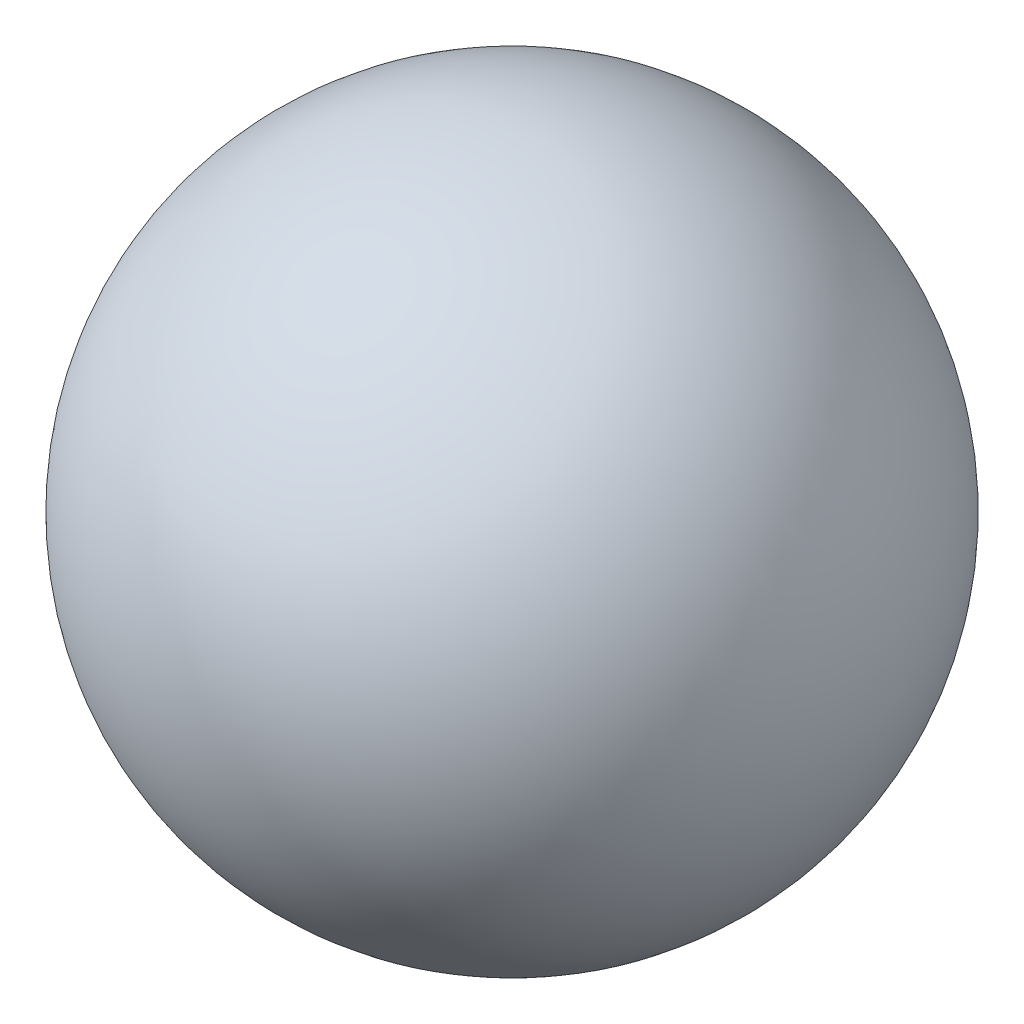
ISO-10303-21;
HEADER;
FILE_DESCRIPTION(('STEP AP214'),'2;1');
FILE_NAME('part.step','',(''),(''),'','','');
FILE_SCHEMA(('AUTOMOTIVE_DESIGN { 1 0 10303 214 1 1 1 1 }'));
ENDSEC;
DATA;
#1=APPLICATION_CONTEXT('core data for automotive mechanical design processes');
#2=APPLICATION_PROTOCOL_DEFINITION('international standard','automotive_design',2000,#1);
#3=PRODUCT_CONTEXT('',#1,'mechanical');
#4=PRODUCT('Part','Part','',(#3));
#5=PRODUCT_RELATED_PRODUCT_CATEGORY('part','',(#4));
#6=PRODUCT_DEFINITION_FORMATION('','',#4);
#7=PRODUCT_DEFINITION_CONTEXT('part definition',#1,'design');
#8=PRODUCT_DEFINITION('design','',#6,#7);
#9=PRODUCT_DEFINITION_SHAPE('','',#8);
#10=(LENGTH_UNIT() NAMED_UNIT(*) SI_UNIT(.MILLI.,.METRE.));
#11=(NAMED_UNIT(*) PLANE_ANGLE_UNIT() SI_UNIT($,.RADIAN.));
#12=(NAMED_UNIT(*) SI_UNIT($,.STERADIAN.) SOLID_ANGLE_UNIT());
#13=UNCERTAINTY_MEASURE_WITH_UNIT(LENGTH_MEASURE(1.E-05),#10,'distance_accuracy_value','');
#14=(GEOMETRIC_REPRESENTATION_CONTEXT(3) GLOBAL_UNCERTAINTY_ASSIGNED_CONTEXT((#13)) GLOBAL_UNIT_ASSIGNED_CONTEXT((#10,
#11,#12)) REPRESENTATION_CONTEXT('',''));
#15=CARTESIAN_POINT('',(0.,0.,0.));
#16=DIRECTION('',(0.,0.,1.));
#17=DIRECTION('',(1.,0.,0.));
#18=AXIS2_PLACEMENT_3D('',#15,#16,#17);
#19=CARTESIAN_POINT('',(121.253630277684,114.595584396519,22.5449391064666));
#20=DIRECTION('',(0.,1.,0.));
#21=DIRECTION('',(1.,0.,0.));
#22=AXIS2_PLACEMENT_3D('',#19,#20,#21);
#23=SPHERICAL_SURFACE('',#22,20.1231248708449);
#24=CARTESIAN_POINT('',(121.253630277684,134.718709267364,22.5449391064666));
#25=VERTEX_POINT('',#24);
#26=VERTEX_LOOP('',#25);
#27=FACE_BOUND('',#26,.T.);
#28=ADVANCED_FACE('F35',(#27),#23,.T.);
#29=CLOSED_SHELL('',(#28));
#30=MANIFOLD_SOLID_BREP('B2',#29);
#31=ADVANCED_BREP_SHAPE_REPRESENTATION('',(#18,#30),#14);
#32=SHAPE_DEFINITION_REPRESENTATION(#9,#31);
ENDSEC;
END-ISO-10303-21;
